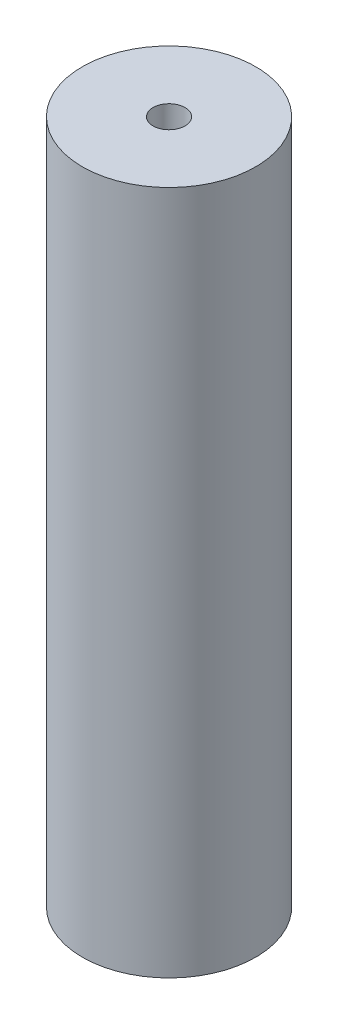
ISO-10303-21;
HEADER;
FILE_DESCRIPTION(('STEP AP214'),'2;1');
FILE_NAME('part.step','',(''),(''),'','','');
FILE_SCHEMA(('AUTOMOTIVE_DESIGN { 1 0 10303 214 1 1 1 1 }'));
ENDSEC;
DATA;
#1=APPLICATION_CONTEXT('core data for automotive mechanical design processes');
#2=APPLICATION_PROTOCOL_DEFINITION('international standard','automotive_design',2000,#1);
#3=PRODUCT_CONTEXT('',#1,'mechanical');
#4=PRODUCT('Part','Part','',(#3));
#5=PRODUCT_RELATED_PRODUCT_CATEGORY('part','',(#4));
#6=PRODUCT_DEFINITION_FORMATION('','',#4);
#7=PRODUCT_DEFINITION_CONTEXT('part definition',#1,'design');
#8=PRODUCT_DEFINITION('design','',#6,#7);
#9=PRODUCT_DEFINITION_SHAPE('','',#8);
#10=(LENGTH_UNIT() NAMED_UNIT(*) SI_UNIT(.MILLI.,.METRE.));
#11=(NAMED_UNIT(*) PLANE_ANGLE_UNIT() SI_UNIT($,.RADIAN.));
#12=(NAMED_UNIT(*) SI_UNIT($,.STERADIAN.) SOLID_ANGLE_UNIT());
#13=UNCERTAINTY_MEASURE_WITH_UNIT(LENGTH_MEASURE(1.E-05),#10,'distance_accuracy_value','');
#14=(GEOMETRIC_REPRESENTATION_CONTEXT(3) GLOBAL_UNCERTAINTY_ASSIGNED_CONTEXT((#13)) GLOBAL_UNIT_ASSIGNED_CONTEXT((#10,
#11,#12)) REPRESENTATION_CONTEXT('',''));
#15=CARTESIAN_POINT('',(0.,0.,0.));
#16=DIRECTION('',(0.,0.,1.));
#17=DIRECTION('',(1.,0.,0.));
#18=AXIS2_PLACEMENT_3D('',#15,#16,#17);
#19=CARTESIAN_POINT('',(0.,150.,0.));
#20=DIRECTION('',(0.,1.,0.));
#21=DIRECTION('',(0.,0.,1.));
#22=AXIS2_PLACEMENT_3D('',#19,#20,#21);
#23=PLANE('',#22);
#24=CARTESIAN_POINT('',(0.,150.,0.));
#25=DIRECTION('',(0.,1.,0.));
#26=DIRECTION('',(0.,0.,1.));
#27=AXIS2_PLACEMENT_3D('',#24,#25,#26);
#28=CIRCLE('',#27,19.);
#29=CARTESIAN_POINT('',(0.,150.,19.));
#30=VERTEX_POINT('',#29);
#31=EDGE_CURVE('E10',#30,#30,#28,.T.);
#32=ORIENTED_EDGE('',*,*,#31,.T.);
#33=EDGE_LOOP('',(#32));
#34=FACE_BOUND('',#33,.T.);
#35=CARTESIAN_POINT('',(0.,150.,0.));
#36=DIRECTION('',(0.,1.,0.));
#37=DIRECTION('',(0.,0.,1.));
#38=AXIS2_PLACEMENT_3D('',#35,#36,#37);
#39=CIRCLE('',#38,3.5);
#40=CARTESIAN_POINT('',(0.,150.,3.5));
#41=VERTEX_POINT('',#40);
#42=EDGE_CURVE('E42',#41,#41,#39,.T.);
#43=ORIENTED_EDGE('',*,*,#42,.F.);
#44=EDGE_LOOP('',(#43));
#45=FACE_BOUND('',#44,.T.);
#46=ADVANCED_FACE('F31',(#34,#45),#23,.T.);
#47=CARTESIAN_POINT('',(0.,0.,0.));
#48=DIRECTION('',(0.,1.,0.));
#49=DIRECTION('',(0.,0.,1.));
#50=AXIS2_PLACEMENT_3D('',#47,#48,#49);
#51=PLANE('',#50);
#52=CARTESIAN_POINT('',(0.,0.,0.));
#53=DIRECTION('',(0.,1.,0.));
#54=DIRECTION('',(0.,0.,1.));
#55=AXIS2_PLACEMENT_3D('',#52,#53,#54);
#56=CIRCLE('',#55,19.);
#57=CARTESIAN_POINT('',(0.,0.,19.));
#58=VERTEX_POINT('',#57);
#59=EDGE_CURVE('E35',#58,#58,#56,.T.);
#60=ORIENTED_EDGE('',*,*,#59,.F.);
#61=EDGE_LOOP('',(#60));
#62=FACE_BOUND('',#61,.T.);
#63=CARTESIAN_POINT('',(0.,0.,0.));
#64=DIRECTION('',(0.,1.,0.));
#65=DIRECTION('',(0.,0.,1.));
#66=AXIS2_PLACEMENT_3D('',#63,#64,#65);
#67=CIRCLE('',#66,3.5);
#68=CARTESIAN_POINT('',(0.,0.,3.5));
#69=VERTEX_POINT('',#68);
#70=EDGE_CURVE('E44',#69,#69,#67,.T.);
#71=ORIENTED_EDGE('',*,*,#70,.T.);
#72=EDGE_LOOP('',(#71));
#73=FACE_BOUND('',#72,.T.);
#74=ADVANCED_FACE('F54',(#62,#73),#51,.F.);
#75=CARTESIAN_POINT('',(0.,150.,0.));
#76=DIRECTION('',(0.,-1.,0.));
#77=DIRECTION('',(0.,0.,-1.));
#78=AXIS2_PLACEMENT_3D('',#75,#76,#77);
#79=CYLINDRICAL_SURFACE('',#78,19.);
#80=ORIENTED_EDGE('',*,*,#31,.F.);
#81=EDGE_LOOP('',(#80));
#82=FACE_BOUND('',#81,.T.);
#83=ORIENTED_EDGE('',*,*,#59,.T.);
#84=EDGE_LOOP('',(#83));
#85=FACE_BOUND('',#84,.T.);
#86=ADVANCED_FACE('F33',(#82,#85),#79,.T.);
#87=CARTESIAN_POINT('',(0.,150.,0.));
#88=DIRECTION('',(0.,-1.,0.));
#89=DIRECTION('',(0.,0.,-1.));
#90=AXIS2_PLACEMENT_3D('',#87,#88,#89);
#91=CYLINDRICAL_SURFACE('',#90,3.5);
#92=ORIENTED_EDGE('',*,*,#42,.T.);
#93=EDGE_LOOP('',(#92));
#94=FACE_BOUND('',#93,.T.);
#95=ORIENTED_EDGE('',*,*,#70,.F.);
#96=EDGE_LOOP('',(#95));
#97=FACE_BOUND('',#96,.T.);
#98=ADVANCED_FACE('F50',(#94,#97),#91,.F.);
#99=CLOSED_SHELL('',(#46,#74,#86,#98));
#100=MANIFOLD_SOLID_BREP('B2',#99);
#101=ADVANCED_BREP_SHAPE_REPRESENTATION('',(#18,#100),#14);
#102=SHAPE_DEFINITION_REPRESENTATION(#9,#101);
ENDSEC;
END-ISO-10303-21;
